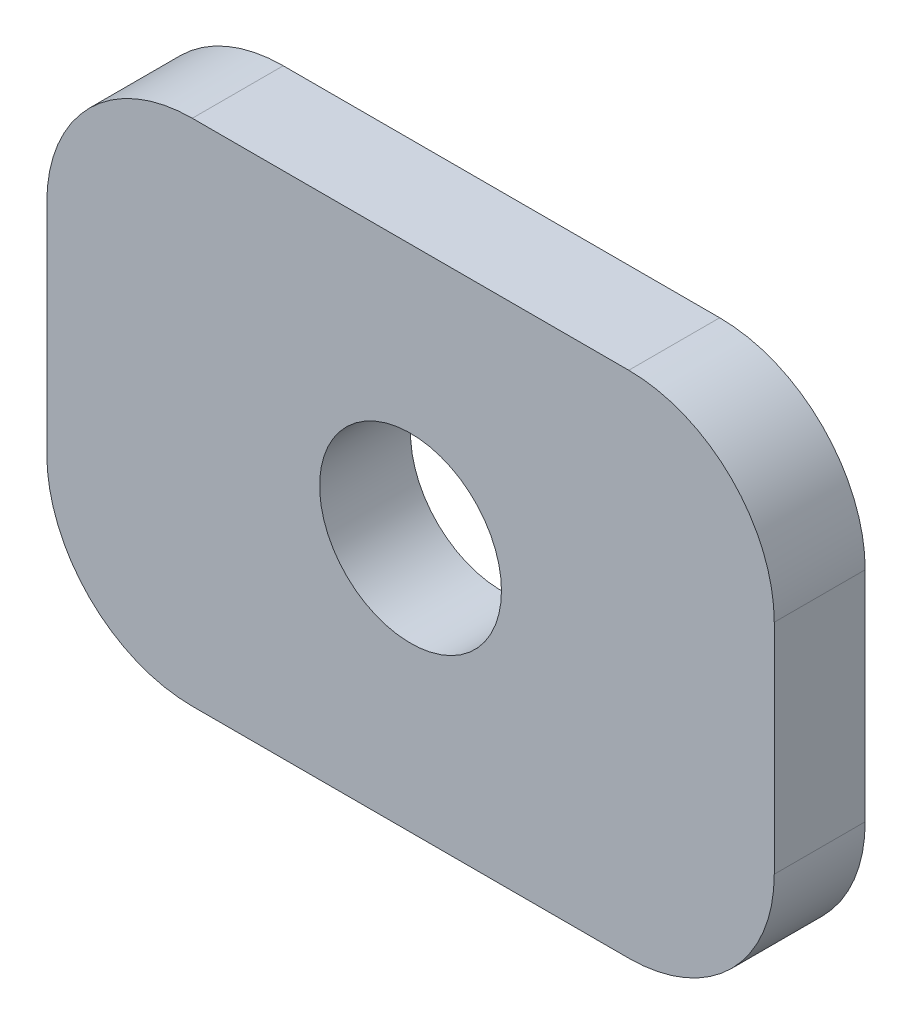
ISO-10303-21;
HEADER;
FILE_DESCRIPTION(('STEP AP214'),'2;1');
FILE_NAME('part.step','',(''),(''),'','','');
FILE_SCHEMA(('AUTOMOTIVE_DESIGN { 1 0 10303 214 1 1 1 1 }'));
ENDSEC;
DATA;
#1=APPLICATION_CONTEXT('core data for automotive mechanical design processes');
#2=APPLICATION_PROTOCOL_DEFINITION('international standard','automotive_design',2000,#1);
#3=PRODUCT_CONTEXT('',#1,'mechanical');
#4=PRODUCT('Part','Part','',(#3));
#5=PRODUCT_RELATED_PRODUCT_CATEGORY('part','',(#4));
#6=PRODUCT_DEFINITION_FORMATION('','',#4);
#7=PRODUCT_DEFINITION_CONTEXT('part definition',#1,'design');
#8=PRODUCT_DEFINITION('design','',#6,#7);
#9=PRODUCT_DEFINITION_SHAPE('','',#8);
#10=(LENGTH_UNIT() NAMED_UNIT(*) SI_UNIT(.MILLI.,.METRE.));
#11=(NAMED_UNIT(*) PLANE_ANGLE_UNIT() SI_UNIT($,.RADIAN.));
#12=(NAMED_UNIT(*) SI_UNIT($,.STERADIAN.) SOLID_ANGLE_UNIT());
#13=UNCERTAINTY_MEASURE_WITH_UNIT(LENGTH_MEASURE(1.E-05),#10,'distance_accuracy_value','');
#14=(GEOMETRIC_REPRESENTATION_CONTEXT(3) GLOBAL_UNCERTAINTY_ASSIGNED_CONTEXT((#13)) GLOBAL_UNIT_ASSIGNED_CONTEXT((#10,
#11,#12)) REPRESENTATION_CONTEXT('',''));
#15=CARTESIAN_POINT('',(0.,0.,0.));
#16=DIRECTION('',(0.,0.,1.));
#17=DIRECTION('',(1.,0.,0.));
#18=AXIS2_PLACEMENT_3D('',#15,#16,#17);
#19=CARTESIAN_POINT('',(0.,0.,3.175));
#20=DIRECTION('',(1.,0.,0.));
#21=DIRECTION('',(0.,1.,0.));
#22=AXIS2_PLACEMENT_3D('',#19,#20,#21);
#23=PLANE('',#22);
#24=DIRECTION('',(0.,-1.,0.));
#25=VECTOR('',#24,1.);
#26=CARTESIAN_POINT('',(0.,0.,0.));
#27=LINE('',#26,#25);
#28=CARTESIAN_POINT('',(0.,-5.08,0.));
#29=VERTEX_POINT('',#28);
#30=CARTESIAN_POINT('',(0.,-12.7,0.));
#31=VERTEX_POINT('',#30);
#32=EDGE_CURVE('E125',#29,#31,#27,.T.);
#33=ORIENTED_EDGE('',*,*,#32,.T.);
#34=DIRECTION('',(0.,0.,-1.));
#35=VECTOR('',#34,1.);
#36=CARTESIAN_POINT('',(0.,-12.7,3.175));
#37=LINE('',#36,#35);
#38=CARTESIAN_POINT('',(0.,-12.7,3.175));
#39=VERTEX_POINT('',#38);
#40=EDGE_CURVE('E103',#31,#39,#37,.F.);
#41=ORIENTED_EDGE('',*,*,#40,.T.);
#42=DIRECTION('',(0.,-1.,0.));
#43=VECTOR('',#42,1.);
#44=CARTESIAN_POINT('',(0.,0.,3.175));
#45=LINE('',#44,#43);
#46=CARTESIAN_POINT('',(0.,-5.08,3.175));
#47=VERTEX_POINT('',#46);
#48=EDGE_CURVE('E135',#47,#39,#45,.T.);
#49=ORIENTED_EDGE('',*,*,#48,.F.);
#50=DIRECTION('',(0.,0.,-1.));
#51=VECTOR('',#50,1.);
#52=CARTESIAN_POINT('',(0.,-5.08,3.175));
#53=LINE('',#52,#51);
#54=EDGE_CURVE('E108',#47,#29,#53,.T.);
#55=ORIENTED_EDGE('',*,*,#54,.T.);
#56=EDGE_LOOP('',(#33,#41,#49,#55));
#57=FACE_BOUND('',#56,.T.);
#58=ADVANCED_FACE('F33',(#57),#23,.F.);
#59=CARTESIAN_POINT('',(0.,-17.78,3.175));
#60=DIRECTION('',(0.,1.,0.));
#61=DIRECTION('',(0.,0.,1.));
#62=AXIS2_PLACEMENT_3D('',#59,#60,#61);
#63=PLANE('',#62);
#64=DIRECTION('',(1.,0.,0.));
#65=VECTOR('',#64,1.);
#66=CARTESIAN_POINT('',(0.,-17.78,3.175));
#67=LINE('',#66,#65);
#68=CARTESIAN_POINT('',(5.08,-17.78,3.175));
#69=VERTEX_POINT('',#68);
#70=CARTESIAN_POINT('',(20.32,-17.78,3.175));
#71=VERTEX_POINT('',#70);
#72=EDGE_CURVE('E118',#69,#71,#67,.T.);
#73=ORIENTED_EDGE('',*,*,#72,.F.);
#74=DIRECTION('',(0.,0.,-1.));
#75=VECTOR('',#74,1.);
#76=CARTESIAN_POINT('',(5.08,-17.78,3.175));
#77=LINE('',#76,#75);
#78=CARTESIAN_POINT('',(5.08,-17.78,0.));
#79=VERTEX_POINT('',#78);
#80=EDGE_CURVE('E102',#69,#79,#77,.T.);
#81=ORIENTED_EDGE('',*,*,#80,.T.);
#82=DIRECTION('',(1.,0.,0.));
#83=VECTOR('',#82,1.);
#84=CARTESIAN_POINT('',(0.,-17.78,0.));
#85=LINE('',#84,#83);
#86=CARTESIAN_POINT('',(20.32,-17.78,0.));
#87=VERTEX_POINT('',#86);
#88=EDGE_CURVE('E115',#79,#87,#85,.T.);
#89=ORIENTED_EDGE('',*,*,#88,.T.);
#90=DIRECTION('',(0.,0.,-1.));
#91=VECTOR('',#90,1.);
#92=CARTESIAN_POINT('',(20.32,-17.78,3.175));
#93=LINE('',#92,#91);
#94=EDGE_CURVE('E120',#87,#71,#93,.F.);
#95=ORIENTED_EDGE('',*,*,#94,.T.);
#96=EDGE_LOOP('',(#73,#81,#89,#95));
#97=FACE_BOUND('',#96,.T.);
#98=ADVANCED_FACE('F114',(#97),#63,.F.);
#99=CARTESIAN_POINT('',(25.4,0.,3.175));
#100=DIRECTION('',(-1.,0.,0.));
#101=DIRECTION('',(0.,-1.,0.));
#102=AXIS2_PLACEMENT_3D('',#99,#100,#101);
#103=PLANE('',#102);
#104=DIRECTION('',(0.,1.,0.));
#105=VECTOR('',#104,1.);
#106=CARTESIAN_POINT('',(25.4,0.,3.175));
#107=LINE('',#106,#105);
#108=CARTESIAN_POINT('',(25.4,-12.7,3.175));
#109=VERTEX_POINT('',#108);
#110=CARTESIAN_POINT('',(25.4,-5.08,3.175));
#111=VERTEX_POINT('',#110);
#112=EDGE_CURVE('E169',#109,#111,#107,.T.);
#113=ORIENTED_EDGE('',*,*,#112,.F.);
#114=DIRECTION('',(0.,0.,-1.));
#115=VECTOR('',#114,1.);
#116=CARTESIAN_POINT('',(25.4,-12.7,3.175));
#117=LINE('',#116,#115);
#118=CARTESIAN_POINT('',(25.4,-12.7,0.));
#119=VERTEX_POINT('',#118);
#120=EDGE_CURVE('E154',#109,#119,#117,.T.);
#121=ORIENTED_EDGE('',*,*,#120,.T.);
#122=DIRECTION('',(0.,1.,0.));
#123=VECTOR('',#122,1.);
#124=CARTESIAN_POINT('',(25.4,0.,0.));
#125=LINE('',#124,#123);
#126=CARTESIAN_POINT('',(25.4,-5.08,0.));
#127=VERTEX_POINT('',#126);
#128=EDGE_CURVE('E124',#119,#127,#125,.T.);
#129=ORIENTED_EDGE('',*,*,#128,.T.);
#130=DIRECTION('',(0.,0.,-1.));
#131=VECTOR('',#130,1.);
#132=CARTESIAN_POINT('',(25.4,-5.08,3.175));
#133=LINE('',#132,#131);
#134=EDGE_CURVE('E152',#127,#111,#133,.F.);
#135=ORIENTED_EDGE('',*,*,#134,.T.);
#136=EDGE_LOOP('',(#113,#121,#129,#135));
#137=FACE_BOUND('',#136,.T.);
#138=ADVANCED_FACE('F185',(#137),#103,.F.);
#139=CARTESIAN_POINT('',(0.,0.,3.175));
#140=DIRECTION('',(0.,-1.,0.));
#141=DIRECTION('',(0.,0.,-1.));
#142=AXIS2_PLACEMENT_3D('',#139,#140,#141);
#143=PLANE('',#142);
#144=DIRECTION('',(-1.,0.,0.));
#145=VECTOR('',#144,1.);
#146=CARTESIAN_POINT('',(0.,0.,0.));
#147=LINE('',#146,#145);
#148=CARTESIAN_POINT('',(20.32,0.,0.));
#149=VERTEX_POINT('',#148);
#150=CARTESIAN_POINT('',(5.08,0.,0.));
#151=VERTEX_POINT('',#150);
#152=EDGE_CURVE('E128',#149,#151,#147,.T.);
#153=ORIENTED_EDGE('',*,*,#152,.T.);
#154=DIRECTION('',(0.,0.,-1.));
#155=VECTOR('',#154,1.);
#156=CARTESIAN_POINT('',(5.08,0.,3.175));
#157=LINE('',#156,#155);
#158=CARTESIAN_POINT('',(5.08,0.,3.175));
#159=VERTEX_POINT('',#158);
#160=EDGE_CURVE('E11',#151,#159,#157,.F.);
#161=ORIENTED_EDGE('',*,*,#160,.T.);
#162=DIRECTION('',(-1.,0.,0.));
#163=VECTOR('',#162,1.);
#164=CARTESIAN_POINT('',(0.,0.,3.175));
#165=LINE('',#164,#163);
#166=CARTESIAN_POINT('',(20.32,0.,3.175));
#167=VERTEX_POINT('',#166);
#168=EDGE_CURVE('E136',#167,#159,#165,.T.);
#169=ORIENTED_EDGE('',*,*,#168,.F.);
#170=DIRECTION('',(0.,0.,-1.));
#171=VECTOR('',#170,1.);
#172=CARTESIAN_POINT('',(20.32,0.,3.175));
#173=LINE('',#172,#171);
#174=EDGE_CURVE('E41',#167,#149,#173,.T.);
#175=ORIENTED_EDGE('',*,*,#174,.T.);
#176=EDGE_LOOP('',(#153,#161,#169,#175));
#177=FACE_BOUND('',#176,.T.);
#178=ADVANCED_FACE('F159',(#177),#143,.F.);
#179=CARTESIAN_POINT('',(0.,0.,3.175));
#180=DIRECTION('',(0.,0.,1.));
#181=DIRECTION('',(1.,0.,0.));
#182=AXIS2_PLACEMENT_3D('',#179,#180,#181);
#183=PLANE('',#182);
#184=CARTESIAN_POINT('',(12.7,-8.89,3.175));
#185=DIRECTION('',(0.,0.,1.));
#186=DIRECTION('',(1.,0.,0.));
#187=AXIS2_PLACEMENT_3D('',#184,#185,#186);
#188=CIRCLE('',#187,3.17500000000001);
#189=CARTESIAN_POINT('',(15.875,-8.89,3.175));
#190=VERTEX_POINT('',#189);
#191=EDGE_CURVE('E278',#190,#190,#188,.T.);
#192=ORIENTED_EDGE('',*,*,#191,.F.);
#193=EDGE_LOOP('',(#192));
#194=FACE_BOUND('',#193,.T.);
#195=ORIENTED_EDGE('',*,*,#48,.T.);
#196=CARTESIAN_POINT('',(5.08,-12.7,3.175));
#197=DIRECTION('',(0.,0.,1.));
#198=DIRECTION('',(1.,0.,0.));
#199=AXIS2_PLACEMENT_3D('',#196,#197,#198);
#200=CIRCLE('',#199,5.08);
#201=EDGE_CURVE('E150',#39,#69,#200,.T.);
#202=ORIENTED_EDGE('',*,*,#201,.T.);
#203=ORIENTED_EDGE('',*,*,#72,.T.);
#204=CARTESIAN_POINT('',(20.32,-12.7,3.175));
#205=DIRECTION('',(0.,0.,1.));
#206=DIRECTION('',(1.,0.,0.));
#207=AXIS2_PLACEMENT_3D('',#204,#205,#206);
#208=CIRCLE('',#207,5.08);
#209=EDGE_CURVE('E148',#71,#109,#208,.T.);
#210=ORIENTED_EDGE('',*,*,#209,.T.);
#211=ORIENTED_EDGE('',*,*,#112,.T.);
#212=CARTESIAN_POINT('',(20.32,-5.08,3.175));
#213=DIRECTION('',(0.,0.,1.));
#214=DIRECTION('',(1.,0.,0.));
#215=AXIS2_PLACEMENT_3D('',#212,#213,#214);
#216=CIRCLE('',#215,5.08);
#217=EDGE_CURVE('E53',#111,#167,#216,.T.);
#218=ORIENTED_EDGE('',*,*,#217,.T.);
#219=ORIENTED_EDGE('',*,*,#168,.T.);
#220=CARTESIAN_POINT('',(5.08,-5.08,3.175));
#221=DIRECTION('',(0.,0.,1.));
#222=DIRECTION('',(1.,0.,0.));
#223=AXIS2_PLACEMENT_3D('',#220,#221,#222);
#224=CIRCLE('',#223,5.08);
#225=EDGE_CURVE('E146',#159,#47,#224,.T.);
#226=ORIENTED_EDGE('',*,*,#225,.T.);
#227=EDGE_LOOP('',(#195,#202,#203,#210,#211,#218,#219,#226));
#228=FACE_BOUND('',#227,.T.);
#229=ADVANCED_FACE('F174',(#194,#228),#183,.T.);
#230=CARTESIAN_POINT('',(0.,0.,0.));
#231=DIRECTION('',(0.,0.,1.));
#232=DIRECTION('',(1.,0.,0.));
#233=AXIS2_PLACEMENT_3D('',#230,#231,#232);
#234=PLANE('',#233);
#235=CARTESIAN_POINT('',(12.7,-8.89,0.));
#236=DIRECTION('',(0.,0.,1.));
#237=DIRECTION('',(1.,0.,0.));
#238=AXIS2_PLACEMENT_3D('',#235,#236,#237);
#239=CIRCLE('',#238,3.17500000000001);
#240=CARTESIAN_POINT('',(15.875,-8.89,0.));
#241=VERTEX_POINT('',#240);
#242=EDGE_CURVE('E130',#241,#241,#239,.T.);
#243=ORIENTED_EDGE('',*,*,#242,.T.);
#244=EDGE_LOOP('',(#243));
#245=FACE_BOUND('',#244,.T.);
#246=ORIENTED_EDGE('',*,*,#88,.F.);
#247=CARTESIAN_POINT('',(5.08,-12.7,0.));
#248=DIRECTION('',(0.,0.,1.));
#249=DIRECTION('',(1.,0.,0.));
#250=AXIS2_PLACEMENT_3D('',#247,#248,#249);
#251=CIRCLE('',#250,5.08);
#252=EDGE_CURVE('E98',#79,#31,#251,.F.);
#253=ORIENTED_EDGE('',*,*,#252,.T.);
#254=ORIENTED_EDGE('',*,*,#32,.F.);
#255=CARTESIAN_POINT('',(5.08,-5.08,0.));
#256=DIRECTION('',(0.,0.,1.));
#257=DIRECTION('',(1.,0.,0.));
#258=AXIS2_PLACEMENT_3D('',#255,#256,#257);
#259=CIRCLE('',#258,5.08);
#260=EDGE_CURVE('E139',#29,#151,#259,.F.);
#261=ORIENTED_EDGE('',*,*,#260,.T.);
#262=ORIENTED_EDGE('',*,*,#152,.F.);
#263=CARTESIAN_POINT('',(20.32,-5.08,0.));
#264=DIRECTION('',(0.,0.,1.));
#265=DIRECTION('',(1.,0.,0.));
#266=AXIS2_PLACEMENT_3D('',#263,#264,#265);
#267=CIRCLE('',#266,5.08);
#268=EDGE_CURVE('E119',#149,#127,#267,.F.);
#269=ORIENTED_EDGE('',*,*,#268,.T.);
#270=ORIENTED_EDGE('',*,*,#128,.F.);
#271=CARTESIAN_POINT('',(20.32,-12.7,0.));
#272=DIRECTION('',(0.,0.,1.));
#273=DIRECTION('',(1.,0.,0.));
#274=AXIS2_PLACEMENT_3D('',#271,#272,#273);
#275=CIRCLE('',#274,5.08);
#276=EDGE_CURVE('E109',#119,#87,#275,.F.);
#277=ORIENTED_EDGE('',*,*,#276,.T.);
#278=EDGE_LOOP('',(#246,#253,#254,#261,#262,#269,#270,#277));
#279=FACE_BOUND('',#278,.T.);
#280=ADVANCED_FACE('F122',(#245,#279),#234,.F.);
#281=CARTESIAN_POINT('',(12.7,-8.89,3.175));
#282=DIRECTION('',(0.,0.,1.));
#283=DIRECTION('',(1.,0.,0.));
#284=AXIS2_PLACEMENT_3D('',#281,#282,#283);
#285=CYLINDRICAL_SURFACE('',#284,3.17500000000001);
#286=ORIENTED_EDGE('',*,*,#242,.F.);
#287=EDGE_LOOP('',(#286));
#288=FACE_BOUND('',#287,.T.);
#289=ORIENTED_EDGE('',*,*,#191,.T.);
#290=EDGE_LOOP('',(#289));
#291=FACE_BOUND('',#290,.T.);
#292=ADVANCED_FACE('F182',(#288,#291),#285,.F.);
#293=CARTESIAN_POINT('',(5.08,-12.7,3.175));
#294=DIRECTION('',(0.,0.,-1.));
#295=DIRECTION('',(-1.,0.,0.));
#296=AXIS2_PLACEMENT_3D('',#293,#294,#295);
#297=CYLINDRICAL_SURFACE('',#296,5.08);
#298=ORIENTED_EDGE('',*,*,#201,.F.);
#299=ORIENTED_EDGE('',*,*,#40,.F.);
#300=ORIENTED_EDGE('',*,*,#252,.F.);
#301=ORIENTED_EDGE('',*,*,#80,.F.);
#302=EDGE_LOOP('',(#298,#299,#300,#301));
#303=FACE_BOUND('',#302,.T.);
#304=ADVANCED_FACE('F101',(#303),#297,.T.);
#305=CARTESIAN_POINT('',(20.32,-12.7,3.175));
#306=DIRECTION('',(0.,0.,-1.));
#307=DIRECTION('',(-1.,0.,0.));
#308=AXIS2_PLACEMENT_3D('',#305,#306,#307);
#309=CYLINDRICAL_SURFACE('',#308,5.08);
#310=ORIENTED_EDGE('',*,*,#209,.F.);
#311=ORIENTED_EDGE('',*,*,#94,.F.);
#312=ORIENTED_EDGE('',*,*,#276,.F.);
#313=ORIENTED_EDGE('',*,*,#120,.F.);
#314=EDGE_LOOP('',(#310,#311,#312,#313));
#315=FACE_BOUND('',#314,.T.);
#316=ADVANCED_FACE('F199',(#315),#309,.T.);
#317=CARTESIAN_POINT('',(5.08,-5.08,3.175));
#318=DIRECTION('',(0.,0.,-1.));
#319=DIRECTION('',(-1.,0.,0.));
#320=AXIS2_PLACEMENT_3D('',#317,#318,#319);
#321=CYLINDRICAL_SURFACE('',#320,5.08);
#322=ORIENTED_EDGE('',*,*,#225,.F.);
#323=ORIENTED_EDGE('',*,*,#160,.F.);
#324=ORIENTED_EDGE('',*,*,#260,.F.);
#325=ORIENTED_EDGE('',*,*,#54,.F.);
#326=EDGE_LOOP('',(#322,#323,#324,#325));
#327=FACE_BOUND('',#326,.T.);
#328=ADVANCED_FACE('F164',(#327),#321,.T.);
#329=CARTESIAN_POINT('',(20.32,-5.08,3.175));
#330=DIRECTION('',(0.,0.,-1.));
#331=DIRECTION('',(-1.,0.,0.));
#332=AXIS2_PLACEMENT_3D('',#329,#330,#331);
#333=CYLINDRICAL_SURFACE('',#332,5.08);
#334=ORIENTED_EDGE('',*,*,#217,.F.);
#335=ORIENTED_EDGE('',*,*,#134,.F.);
#336=ORIENTED_EDGE('',*,*,#268,.F.);
#337=ORIENTED_EDGE('',*,*,#174,.F.);
#338=EDGE_LOOP('',(#334,#335,#336,#337));
#339=FACE_BOUND('',#338,.T.);
#340=ADVANCED_FACE('F35',(#339),#333,.T.);
#341=CLOSED_SHELL('',(#58,#98,#138,#178,#229,#280,#292,#304,#316,#328,#340));
#342=MANIFOLD_SOLID_BREP('B2',#341);
#343=ADVANCED_BREP_SHAPE_REPRESENTATION('',(#18,#342),#14);
#344=SHAPE_DEFINITION_REPRESENTATION(#9,#343);
ENDSEC;
END-ISO-10303-21;
